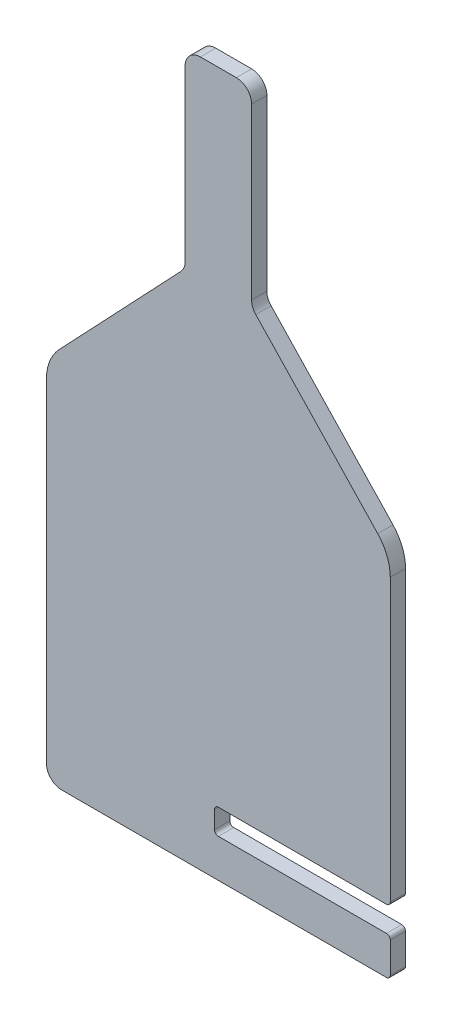
ISO-10303-21;
HEADER;
FILE_DESCRIPTION(('STEP AP214'),'2;1');
FILE_NAME('part.step','',(''),(''),'','','');
FILE_SCHEMA(('AUTOMOTIVE_DESIGN { 1 0 10303 214 1 1 1 1 }'));
ENDSEC;
DATA;
#1=APPLICATION_CONTEXT('core data for automotive mechanical design processes');
#2=APPLICATION_PROTOCOL_DEFINITION('international standard','automotive_design',2000,#1);
#3=PRODUCT_CONTEXT('',#1,'mechanical');
#4=PRODUCT('Part','Part','',(#3));
#5=PRODUCT_RELATED_PRODUCT_CATEGORY('part','',(#4));
#6=PRODUCT_DEFINITION_FORMATION('','',#4);
#7=PRODUCT_DEFINITION_CONTEXT('part definition',#1,'design');
#8=PRODUCT_DEFINITION('design','',#6,#7);
#9=PRODUCT_DEFINITION_SHAPE('','',#8);
#10=(LENGTH_UNIT() NAMED_UNIT(*) SI_UNIT(.MILLI.,.METRE.));
#11=(NAMED_UNIT(*) PLANE_ANGLE_UNIT() SI_UNIT($,.RADIAN.));
#12=(NAMED_UNIT(*) SI_UNIT($,.STERADIAN.) SOLID_ANGLE_UNIT());
#13=UNCERTAINTY_MEASURE_WITH_UNIT(LENGTH_MEASURE(1.E-05),#10,'distance_accuracy_value','');
#14=(GEOMETRIC_REPRESENTATION_CONTEXT(3) GLOBAL_UNCERTAINTY_ASSIGNED_CONTEXT((#13)) GLOBAL_UNIT_ASSIGNED_CONTEXT((#10,
#11,#12)) REPRESENTATION_CONTEXT('',''));
#15=CARTESIAN_POINT('',(0.,0.,0.));
#16=DIRECTION('',(0.,0.,1.));
#17=DIRECTION('',(1.,0.,0.));
#18=AXIS2_PLACEMENT_3D('',#15,#16,#17);
#19=CARTESIAN_POINT('',(22.5,0.828732436273287,2.));
#20=DIRECTION('',(1.,0.,0.));
#21=DIRECTION('',(0.,1.,0.));
#22=AXIS2_PLACEMENT_3D('',#19,#20,#21);
#23=PLANE('',#22);
#24=DIRECTION('',(0.,-1.,0.));
#25=VECTOR('',#24,1.);
#26=CARTESIAN_POINT('',(22.5,0.828732436273287,2.));
#27=LINE('',#26,#25);
#28=CARTESIAN_POINT('',(22.5,-1.56102123255414,2.));
#29=VERTEX_POINT('',#28);
#30=CARTESIAN_POINT('',(22.5,-38.3712675637267,2.));
#31=VERTEX_POINT('',#30);
#32=EDGE_CURVE('E376',#29,#31,#27,.T.);
#33=ORIENTED_EDGE('',*,*,#32,.T.);
#34=DIRECTION('',(0.,0.,1.));
#35=VECTOR('',#34,1.);
#36=CARTESIAN_POINT('',(22.5,-38.3712675637267,0.));
#37=LINE('',#36,#35);
#38=CARTESIAN_POINT('',(22.5,-38.3712675637267,0.));
#39=VERTEX_POINT('',#38);
#40=EDGE_CURVE('E327',#31,#39,#37,.F.);
#41=ORIENTED_EDGE('',*,*,#40,.T.);
#42=DIRECTION('',(0.,-1.,0.));
#43=VECTOR('',#42,1.);
#44=CARTESIAN_POINT('',(22.5,0.828732436273287,0.));
#45=LINE('',#44,#43);
#46=CARTESIAN_POINT('',(22.5,-1.56102123255414,0.));
#47=VERTEX_POINT('',#46);
#48=EDGE_CURVE('E224',#47,#39,#45,.T.);
#49=ORIENTED_EDGE('',*,*,#48,.F.);
#50=DIRECTION('',(0.,0.,-1.));
#51=VECTOR('',#50,1.);
#52=CARTESIAN_POINT('',(22.5,-1.56102123255414,2.));
#53=LINE('',#52,#51);
#54=EDGE_CURVE('E292',#47,#29,#53,.F.);
#55=ORIENTED_EDGE('',*,*,#54,.T.);
#56=EDGE_LOOP('',(#33,#41,#49,#55));
#57=FACE_BOUND('',#56,.T.);
#58=ADVANCED_FACE('F37',(#57),#23,.T.);
#59=CARTESIAN_POINT('',(-4.35,45.,2.));
#60=DIRECTION('',(0.,1.,0.));
#61=DIRECTION('',(0.,0.,1.));
#62=AXIS2_PLACEMENT_3D('',#59,#60,#61);
#63=PLANE('',#62);
#64=DIRECTION('',(1.,0.,0.));
#65=VECTOR('',#64,1.);
#66=CARTESIAN_POINT('',(-4.35,45.,0.));
#67=LINE('',#66,#65);
#68=CARTESIAN_POINT('',(-2.35,45.,0.));
#69=VERTEX_POINT('',#68);
#70=CARTESIAN_POINT('',(2.35,45.,0.));
#71=VERTEX_POINT('',#70);
#72=EDGE_CURVE('E348',#69,#71,#67,.T.);
#73=ORIENTED_EDGE('',*,*,#72,.F.);
#74=DIRECTION('',(0.,0.,-1.));
#75=VECTOR('',#74,1.);
#76=CARTESIAN_POINT('',(-2.35,45.,2.));
#77=LINE('',#76,#75);
#78=CARTESIAN_POINT('',(-2.35,45.,2.));
#79=VERTEX_POINT('',#78);
#80=EDGE_CURVE('E259',#69,#79,#77,.F.);
#81=ORIENTED_EDGE('',*,*,#80,.T.);
#82=DIRECTION('',(1.,0.,0.));
#83=VECTOR('',#82,1.);
#84=CARTESIAN_POINT('',(-4.35,45.,2.));
#85=LINE('',#84,#83);
#86=CARTESIAN_POINT('',(2.35,45.,2.));
#87=VERTEX_POINT('',#86);
#88=EDGE_CURVE('E237',#79,#87,#85,.T.);
#89=ORIENTED_EDGE('',*,*,#88,.T.);
#90=DIRECTION('',(0.,0.,-1.));
#91=VECTOR('',#90,1.);
#92=CARTESIAN_POINT('',(2.35,45.,2.));
#93=LINE('',#92,#91);
#94=EDGE_CURVE('E256',#87,#71,#93,.T.);
#95=ORIENTED_EDGE('',*,*,#94,.T.);
#96=EDGE_LOOP('',(#73,#81,#89,#95));
#97=FACE_BOUND('',#96,.T.);
#98=ADVANCED_FACE('F432',(#97),#63,.T.);
#99=CARTESIAN_POINT('',(-4.35,45.,2.));
#100=DIRECTION('',(1.,0.,0.));
#101=DIRECTION('',(0.,1.,0.));
#102=AXIS2_PLACEMENT_3D('',#99,#100,#101);
#103=PLANE('',#102);
#104=DIRECTION('',(0.,-1.,0.));
#105=VECTOR('',#104,1.);
#106=CARTESIAN_POINT('',(-4.35,45.,0.));
#107=LINE('',#106,#105);
#108=CARTESIAN_POINT('',(-4.35,43.,0.));
#109=VERTEX_POINT('',#108);
#110=CARTESIAN_POINT('',(-4.34999999999999,20.7965545384323,0.));
#111=VERTEX_POINT('',#110);
#112=EDGE_CURVE('E235',#109,#111,#107,.T.);
#113=ORIENTED_EDGE('',*,*,#112,.T.);
#114=DIRECTION('',(0.,0.,-1.));
#115=VECTOR('',#114,1.);
#116=CARTESIAN_POINT('',(-4.34999999999999,20.7965545384323,2.));
#117=LINE('',#116,#115);
#118=CARTESIAN_POINT('',(-4.34999999999999,20.7965545384323,2.));
#119=VERTEX_POINT('',#118);
#120=EDGE_CURVE('E254',#111,#119,#117,.F.);
#121=ORIENTED_EDGE('',*,*,#120,.T.);
#122=DIRECTION('',(0.,-1.,0.));
#123=VECTOR('',#122,1.);
#124=CARTESIAN_POINT('',(-4.35,45.,2.));
#125=LINE('',#124,#123);
#126=CARTESIAN_POINT('',(-4.35,43.,2.));
#127=VERTEX_POINT('',#126);
#128=EDGE_CURVE('E218',#127,#119,#125,.T.);
#129=ORIENTED_EDGE('',*,*,#128,.F.);
#130=DIRECTION('',(0.,0.,-1.));
#131=VECTOR('',#130,1.);
#132=CARTESIAN_POINT('',(-4.35,43.,0.));
#133=LINE('',#132,#131);
#134=EDGE_CURVE('E251',#127,#109,#133,.T.);
#135=ORIENTED_EDGE('',*,*,#134,.T.);
#136=EDGE_LOOP('',(#113,#121,#129,#135));
#137=FACE_BOUND('',#136,.T.);
#138=ADVANCED_FACE('F438',(#137),#103,.F.);
#139=CARTESIAN_POINT('',(-4.34999999999999,20.,2.));
#140=DIRECTION('',(0.72618437741389,-0.687500000000001,0.));
#141=DIRECTION('',(0.687500000000001,0.72618437741389,0.));
#142=AXIS2_PLACEMENT_3D('',#139,#140,#141);
#143=PLANE('',#142);
#144=DIRECTION('',(-0.6875,-0.72618437741389,0.));
#145=VECTOR('',#144,1.);
#146=CARTESIAN_POINT('',(-4.34999999999999,20.,0.));
#147=LINE('',#146,#145);
#148=CARTESIAN_POINT('',(-4.89763124517221,19.4215545384323,0.));
#149=VERTEX_POINT('',#148);
#150=CARTESIAN_POINT('',(-20.8571062644833,2.56406882097633,0.));
#151=VERTEX_POINT('',#150);
#152=EDGE_CURVE('E226',#149,#151,#147,.T.);
#153=ORIENTED_EDGE('',*,*,#152,.T.);
#154=DIRECTION('',(0.,0.,-1.));
#155=VECTOR('',#154,1.);
#156=CARTESIAN_POINT('',(-20.8571062644833,2.56406882097634,2.));
#157=LINE('',#156,#155);
#158=CARTESIAN_POINT('',(-20.8571062644833,2.56406882097633,2.));
#159=VERTEX_POINT('',#158);
#160=EDGE_CURVE('E283',#151,#159,#157,.F.);
#161=ORIENTED_EDGE('',*,*,#160,.T.);
#162=DIRECTION('',(-0.6875,-0.72618437741389,0.));
#163=VECTOR('',#162,1.);
#164=CARTESIAN_POINT('',(-4.34999999999999,20.,2.));
#165=LINE('',#164,#163);
#166=CARTESIAN_POINT('',(-4.89763124517221,19.4215545384323,2.));
#167=VERTEX_POINT('',#166);
#168=EDGE_CURVE('E381',#167,#159,#165,.T.);
#169=ORIENTED_EDGE('',*,*,#168,.F.);
#170=DIRECTION('',(0.,0.,-1.));
#171=VECTOR('',#170,1.);
#172=CARTESIAN_POINT('',(-4.89763124517221,19.4215545384323,0.));
#173=LINE('',#172,#171);
#174=EDGE_CURVE('E248',#167,#149,#173,.T.);
#175=ORIENTED_EDGE('',*,*,#174,.T.);
#176=EDGE_LOOP('',(#153,#161,#169,#175));
#177=FACE_BOUND('',#176,.T.);
#178=ADVANCED_FACE('F414',(#177),#143,.F.);
#179=CARTESIAN_POINT('',(-22.5,0.828732436273288,2.));
#180=DIRECTION('',(1.,0.,0.));
#181=DIRECTION('',(0.,1.,0.));
#182=AXIS2_PLACEMENT_3D('',#179,#180,#181);
#183=PLANE('',#182);
#184=DIRECTION('',(0.,-1.,0.));
#185=VECTOR('',#184,1.);
#186=CARTESIAN_POINT('',(-22.5,0.828732436273288,2.));
#187=LINE('',#186,#185);
#188=CARTESIAN_POINT('',(-22.5,-1.56093117902367,2.));
#189=VERTEX_POINT('',#188);
#190=CARTESIAN_POINT('',(-22.5,-45.1712675637267,2.));
#191=VERTEX_POINT('',#190);
#192=EDGE_CURVE('E379',#189,#191,#187,.T.);
#193=ORIENTED_EDGE('',*,*,#192,.F.);
#194=DIRECTION('',(0.,0.,-1.));
#195=VECTOR('',#194,1.);
#196=CARTESIAN_POINT('',(-22.5,-1.56093117902367,2.));
#197=LINE('',#196,#195);
#198=CARTESIAN_POINT('',(-22.5,-1.56093117902367,0.));
#199=VERTEX_POINT('',#198);
#200=EDGE_CURVE('E276',#189,#199,#197,.T.);
#201=ORIENTED_EDGE('',*,*,#200,.T.);
#202=DIRECTION('',(0.,-1.,0.));
#203=VECTOR('',#202,1.);
#204=CARTESIAN_POINT('',(-22.5,0.828732436273288,0.));
#205=LINE('',#204,#203);
#206=CARTESIAN_POINT('',(-22.5,-45.1712675637267,0.));
#207=VERTEX_POINT('',#206);
#208=EDGE_CURVE('E223',#199,#207,#205,.T.);
#209=ORIENTED_EDGE('',*,*,#208,.T.);
#210=DIRECTION('',(0.,0.,-1.));
#211=VECTOR('',#210,1.);
#212=CARTESIAN_POINT('',(-22.5,-45.1712675637267,2.));
#213=LINE('',#212,#211);
#214=EDGE_CURVE('E203',#207,#191,#213,.F.);
#215=ORIENTED_EDGE('',*,*,#214,.T.);
#216=EDGE_LOOP('',(#193,#201,#209,#215));
#217=FACE_BOUND('',#216,.T.);
#218=ADVANCED_FACE('F409',(#217),#183,.F.);
#219=CARTESIAN_POINT('',(-22.5,-47.1712675637267,2.));
#220=DIRECTION('',(0.,1.,0.));
#221=DIRECTION('',(0.,0.,1.));
#222=AXIS2_PLACEMENT_3D('',#219,#220,#221);
#223=PLANE('',#222);
#224=DIRECTION('',(1.,0.,0.));
#225=VECTOR('',#224,1.);
#226=CARTESIAN_POINT('',(-22.5,-47.1712675637267,0.));
#227=LINE('',#226,#225);
#228=CARTESIAN_POINT('',(-20.5,-47.1712675637267,0.));
#229=VERTEX_POINT('',#228);
#230=CARTESIAN_POINT('',(22.,-47.1712675637267,0.));
#231=VERTEX_POINT('',#230);
#232=EDGE_CURVE('E213',#229,#231,#227,.T.);
#233=ORIENTED_EDGE('',*,*,#232,.T.);
#234=DIRECTION('',(0.,0.,-1.));
#235=VECTOR('',#234,1.);
#236=CARTESIAN_POINT('',(22.,-47.1712675637267,2.));
#237=LINE('',#236,#235);
#238=CARTESIAN_POINT('',(22.,-47.1712675637267,2.));
#239=VERTEX_POINT('',#238);
#240=EDGE_CURVE('E305',#231,#239,#237,.F.);
#241=ORIENTED_EDGE('',*,*,#240,.T.);
#242=DIRECTION('',(1.,0.,0.));
#243=VECTOR('',#242,1.);
#244=CARTESIAN_POINT('',(-22.5,-47.1712675637267,2.));
#245=LINE('',#244,#243);
#246=CARTESIAN_POINT('',(-20.5,-47.1712675637267,2.));
#247=VERTEX_POINT('',#246);
#248=EDGE_CURVE('E216',#247,#239,#245,.T.);
#249=ORIENTED_EDGE('',*,*,#248,.F.);
#250=DIRECTION('',(0.,0.,-1.));
#251=VECTOR('',#250,1.);
#252=CARTESIAN_POINT('',(-20.5,-47.1712675637267,2.));
#253=LINE('',#252,#251);
#254=EDGE_CURVE('E201',#247,#229,#253,.T.);
#255=ORIENTED_EDGE('',*,*,#254,.T.);
#256=EDGE_LOOP('',(#233,#241,#249,#255));
#257=FACE_BOUND('',#256,.T.);
#258=ADVANCED_FACE('F212',(#257),#223,.F.);
#259=CARTESIAN_POINT('',(22.5,-42.6712675637267,2.));
#260=VERTEX_POINT('',#259);
#261=CARTESIAN_POINT('',(22.5,-46.6712675637267,2.));
#262=VERTEX_POINT('',#261);
#263=EDGE_CURVE('E375',#260,#262,#27,.T.);
#264=ORIENTED_EDGE('',*,*,#263,.T.);
#265=DIRECTION('',(0.,0.,-1.));
#266=VECTOR('',#265,1.);
#267=CARTESIAN_POINT('',(22.5,-46.6712675637267,0.));
#268=LINE('',#267,#266);
#269=CARTESIAN_POINT('',(22.5,-46.6712675637267,0.));
#270=VERTEX_POINT('',#269);
#271=EDGE_CURVE('E297',#262,#270,#268,.T.);
#272=ORIENTED_EDGE('',*,*,#271,.T.);
#273=CARTESIAN_POINT('',(22.5,-42.6712675637267,0.));
#274=VERTEX_POINT('',#273);
#275=EDGE_CURVE('E229',#274,#270,#45,.T.);
#276=ORIENTED_EDGE('',*,*,#275,.F.);
#277=DIRECTION('',(0.,0.,1.));
#278=VECTOR('',#277,1.);
#279=CARTESIAN_POINT('',(22.5,-42.6712675637267,2.));
#280=LINE('',#279,#278);
#281=EDGE_CURVE('E294',#274,#260,#280,.T.);
#282=ORIENTED_EDGE('',*,*,#281,.T.);
#283=EDGE_LOOP('',(#264,#272,#276,#282));
#284=FACE_BOUND('',#283,.T.);
#285=ADVANCED_FACE('F397',(#284),#23,.T.);
#286=CARTESIAN_POINT('',(4.35000000000001,19.9990051587737,2.));
#287=DIRECTION('',(0.726166565397782,0.687518813777767,0.));
#288=DIRECTION('',(-0.687518813777767,0.726166565397782,0.));
#289=AXIS2_PLACEMENT_3D('',#286,#287,#288);
#290=PLANE('',#289);
#291=DIRECTION('',(0.687518813777767,-0.726166565397782,0.));
#292=VECTOR('',#291,1.);
#293=CARTESIAN_POINT('',(4.35000000000001,19.9990051587737,2.));
#294=LINE('',#293,#292);
#295=CARTESIAN_POINT('',(4.89766686920444,19.4205520874939,2.));
#296=VERTEX_POINT('',#295);
#297=CARTESIAN_POINT('',(20.8569993923867,2.56409165011246,2.));
#298=VERTEX_POINT('',#297);
#299=EDGE_CURVE('E372',#296,#298,#294,.T.);
#300=ORIENTED_EDGE('',*,*,#299,.T.);
#301=DIRECTION('',(0.,0.,-1.));
#302=VECTOR('',#301,1.);
#303=CARTESIAN_POINT('',(20.8569993923867,2.56409165011245,2.));
#304=LINE('',#303,#302);
#305=CARTESIAN_POINT('',(20.8569993923867,2.56409165011246,0.));
#306=VERTEX_POINT('',#305);
#307=EDGE_CURVE('E289',#298,#306,#304,.T.);
#308=ORIENTED_EDGE('',*,*,#307,.T.);
#309=DIRECTION('',(0.687518813777767,-0.726166565397782,0.));
#310=VECTOR('',#309,1.);
#311=CARTESIAN_POINT('',(4.35000000000001,19.9990051587737,0.));
#312=LINE('',#311,#310);
#313=CARTESIAN_POINT('',(4.89766686920444,19.4205520874939,0.));
#314=VERTEX_POINT('',#313);
#315=EDGE_CURVE('E390',#314,#306,#312,.T.);
#316=ORIENTED_EDGE('',*,*,#315,.F.);
#317=DIRECTION('',(0.,0.,-1.));
#318=VECTOR('',#317,1.);
#319=CARTESIAN_POINT('',(4.89766686920444,19.4205520874939,2.));
#320=LINE('',#319,#318);
#321=EDGE_CURVE('E266',#314,#296,#320,.F.);
#322=ORIENTED_EDGE('',*,*,#321,.T.);
#323=EDGE_LOOP('',(#300,#308,#316,#322));
#324=FACE_BOUND('',#323,.T.);
#325=ADVANCED_FACE('F444',(#324),#290,.T.);
#326=CARTESIAN_POINT('',(4.35,45.,2.));
#327=DIRECTION('',(1.,0.,0.));
#328=DIRECTION('',(0.,1.,0.));
#329=AXIS2_PLACEMENT_3D('',#326,#327,#328);
#330=PLANE('',#329);
#331=DIRECTION('',(0.,-1.,0.));
#332=VECTOR('',#331,1.);
#333=CARTESIAN_POINT('',(4.35,45.,2.));
#334=LINE('',#333,#332);
#335=CARTESIAN_POINT('',(4.35,43.,2.));
#336=VERTEX_POINT('',#335);
#337=CARTESIAN_POINT('',(4.35000000000001,20.7955897150495,2.));
#338=VERTEX_POINT('',#337);
#339=EDGE_CURVE('E369',#336,#338,#334,.T.);
#340=ORIENTED_EDGE('',*,*,#339,.T.);
#341=DIRECTION('',(0.,0.,-1.));
#342=VECTOR('',#341,1.);
#343=CARTESIAN_POINT('',(4.35000000000001,20.7955897150495,0.));
#344=LINE('',#343,#342);
#345=CARTESIAN_POINT('',(4.35000000000001,20.7955897150495,0.));
#346=VERTEX_POINT('',#345);
#347=EDGE_CURVE('E263',#338,#346,#344,.T.);
#348=ORIENTED_EDGE('',*,*,#347,.T.);
#349=DIRECTION('',(0.,-1.,0.));
#350=VECTOR('',#349,1.);
#351=CARTESIAN_POINT('',(4.35,45.,0.));
#352=LINE('',#351,#350);
#353=CARTESIAN_POINT('',(4.35,43.,0.));
#354=VERTEX_POINT('',#353);
#355=EDGE_CURVE('E388',#354,#346,#352,.T.);
#356=ORIENTED_EDGE('',*,*,#355,.F.);
#357=DIRECTION('',(0.,0.,-1.));
#358=VECTOR('',#357,1.);
#359=CARTESIAN_POINT('',(4.35,43.,2.));
#360=LINE('',#359,#358);
#361=EDGE_CURVE('E261',#354,#336,#360,.F.);
#362=ORIENTED_EDGE('',*,*,#361,.T.);
#363=EDGE_LOOP('',(#340,#348,#356,#362));
#364=FACE_BOUND('',#363,.T.);
#365=ADVANCED_FACE('F449',(#364),#330,.T.);
#366=CARTESIAN_POINT('',(0.,0.,2.));
#367=DIRECTION('',(0.,0.,-1.));
#368=DIRECTION('',(-1.,0.,0.));
#369=AXIS2_PLACEMENT_3D('',#366,#367,#368);
#370=PLANE('',#369);
#371=ORIENTED_EDGE('',*,*,#248,.T.);
#372=CARTESIAN_POINT('',(22.,-46.6712675637267,2.));
#373=DIRECTION('',(0.,0.,-1.));
#374=DIRECTION('',(-1.,0.,0.));
#375=AXIS2_PLACEMENT_3D('',#372,#373,#374);
#376=CIRCLE('',#375,0.5);
#377=EDGE_CURVE('E310',#239,#262,#376,.F.);
#378=ORIENTED_EDGE('',*,*,#377,.T.);
#379=ORIENTED_EDGE('',*,*,#263,.F.);
#380=CARTESIAN_POINT('',(22.,-42.6712675637267,2.));
#381=DIRECTION('',(0.,0.,-1.));
#382=DIRECTION('',(-1.,0.,0.));
#383=AXIS2_PLACEMENT_3D('',#380,#381,#382);
#384=CIRCLE('',#383,0.5);
#385=CARTESIAN_POINT('',(22.,-42.1712675637267,2.));
#386=VERTEX_POINT('',#385);
#387=EDGE_CURVE('E308',#260,#386,#384,.F.);
#388=ORIENTED_EDGE('',*,*,#387,.T.);
#389=DIRECTION('',(1.,0.,0.));
#390=VECTOR('',#389,1.);
#391=CARTESIAN_POINT('',(22.5,-42.1712675637267,2.));
#392=LINE('',#391,#390);
#393=CARTESIAN_POINT('',(0.,-42.1712675637267,2.));
#394=VERTEX_POINT('',#393);
#395=EDGE_CURVE('E354',#394,#386,#392,.T.);
#396=ORIENTED_EDGE('',*,*,#395,.F.);
#397=CARTESIAN_POINT('',(0.,-41.6712675637267,2.));
#398=DIRECTION('',(0.,0.,-1.));
#399=DIRECTION('',(-1.,0.,0.));
#400=AXIS2_PLACEMENT_3D('',#397,#398,#399);
#401=CIRCLE('',#400,0.5);
#402=CARTESIAN_POINT('',(-0.500000000000001,-41.6712675637267,2.));
#403=VERTEX_POINT('',#402);
#404=EDGE_CURVE('E329',#394,#403,#401,.T.);
#405=ORIENTED_EDGE('',*,*,#404,.T.);
#406=DIRECTION('',(0.,-1.,0.));
#407=VECTOR('',#406,1.);
#408=CARTESIAN_POINT('',(-0.500000000000001,-38.8712675637267,2.));
#409=LINE('',#408,#407);
#410=CARTESIAN_POINT('',(-0.500000000000001,-39.3712675637267,2.));
#411=VERTEX_POINT('',#410);
#412=EDGE_CURVE('E353',#411,#403,#409,.T.);
#413=ORIENTED_EDGE('',*,*,#412,.F.);
#414=CARTESIAN_POINT('',(0.,-39.3712675637267,2.));
#415=DIRECTION('',(0.,0.,-1.));
#416=DIRECTION('',(-1.,0.,0.));
#417=AXIS2_PLACEMENT_3D('',#414,#415,#416);
#418=CIRCLE('',#417,0.5);
#419=CARTESIAN_POINT('',(0.,-38.8712675637267,2.));
#420=VERTEX_POINT('',#419);
#421=EDGE_CURVE('E45',#411,#420,#418,.T.);
#422=ORIENTED_EDGE('',*,*,#421,.T.);
#423=DIRECTION('',(-1.,0.,0.));
#424=VECTOR('',#423,1.);
#425=CARTESIAN_POINT('',(22.5,-38.8712675637267,2.));
#426=LINE('',#425,#424);
#427=CARTESIAN_POINT('',(22.,-38.8712675637267,2.));
#428=VERTEX_POINT('',#427);
#429=EDGE_CURVE('E358',#428,#420,#426,.T.);
#430=ORIENTED_EDGE('',*,*,#429,.F.);
#431=CARTESIAN_POINT('',(22.,-38.3712675637267,2.));
#432=DIRECTION('',(0.,0.,-1.));
#433=DIRECTION('',(-1.,0.,0.));
#434=AXIS2_PLACEMENT_3D('',#431,#432,#433);
#435=CIRCLE('',#434,0.5);
#436=EDGE_CURVE('E52',#428,#31,#435,.F.);
#437=ORIENTED_EDGE('',*,*,#436,.T.);
#438=ORIENTED_EDGE('',*,*,#32,.F.);
#439=CARTESIAN_POINT('',(16.5,-1.56102123255415,2.));
#440=DIRECTION('',(0.,0.,-1.));
#441=DIRECTION('',(-1.,0.,0.));
#442=AXIS2_PLACEMENT_3D('',#439,#440,#441);
#443=CIRCLE('',#442,6.);
#444=EDGE_CURVE('E285',#29,#298,#443,.F.);
#445=ORIENTED_EDGE('',*,*,#444,.T.);
#446=ORIENTED_EDGE('',*,*,#299,.F.);
#447=CARTESIAN_POINT('',(6.35000000000001,20.7955897150495,2.));
#448=DIRECTION('',(0.,0.,-1.));
#449=DIRECTION('',(-1.,0.,0.));
#450=AXIS2_PLACEMENT_3D('',#447,#448,#449);
#451=CIRCLE('',#450,2.);
#452=EDGE_CURVE('E274',#296,#338,#451,.T.);
#453=ORIENTED_EDGE('',*,*,#452,.T.);
#454=ORIENTED_EDGE('',*,*,#339,.F.);
#455=CARTESIAN_POINT('',(2.35,43.,2.));
#456=DIRECTION('',(0.,0.,-1.));
#457=DIRECTION('',(-1.,0.,0.));
#458=AXIS2_PLACEMENT_3D('',#455,#456,#457);
#459=CIRCLE('',#458,2.);
#460=EDGE_CURVE('E242',#336,#87,#459,.F.);
#461=ORIENTED_EDGE('',*,*,#460,.T.);
#462=ORIENTED_EDGE('',*,*,#88,.F.);
#463=CARTESIAN_POINT('',(-2.35,43.,2.));
#464=DIRECTION('',(0.,0.,-1.));
#465=DIRECTION('',(-1.,0.,0.));
#466=AXIS2_PLACEMENT_3D('',#463,#464,#465);
#467=CIRCLE('',#466,2.);
#468=EDGE_CURVE('E244',#79,#127,#467,.F.);
#469=ORIENTED_EDGE('',*,*,#468,.T.);
#470=ORIENTED_EDGE('',*,*,#128,.T.);
#471=CARTESIAN_POINT('',(-6.34999999999999,20.7965545384323,2.));
#472=DIRECTION('',(0.,0.,-1.));
#473=DIRECTION('',(-1.,0.,0.));
#474=AXIS2_PLACEMENT_3D('',#471,#472,#473);
#475=CIRCLE('',#474,2.);
#476=EDGE_CURVE('E270',#119,#167,#475,.T.);
#477=ORIENTED_EDGE('',*,*,#476,.T.);
#478=ORIENTED_EDGE('',*,*,#168,.T.);
#479=CARTESIAN_POINT('',(-16.5,-1.56093117902366,2.));
#480=DIRECTION('',(0.,0.,-1.));
#481=DIRECTION('',(-1.,0.,0.));
#482=AXIS2_PLACEMENT_3D('',#479,#480,#481);
#483=CIRCLE('',#482,6.);
#484=EDGE_CURVE('E287',#159,#189,#483,.F.);
#485=ORIENTED_EDGE('',*,*,#484,.T.);
#486=ORIENTED_EDGE('',*,*,#192,.T.);
#487=CARTESIAN_POINT('',(-20.5,-45.1712675637267,2.));
#488=DIRECTION('',(0.,0.,-1.));
#489=DIRECTION('',(-1.,0.,0.));
#490=AXIS2_PLACEMENT_3D('',#487,#488,#489);
#491=CIRCLE('',#490,2.);
#492=EDGE_CURVE('E246',#191,#247,#491,.F.);
#493=ORIENTED_EDGE('',*,*,#492,.T.);
#494=EDGE_LOOP('',(#371,#378,#379,#388,#396,#405,#413,#422,#430,#437,#438,#445,#446,#453,#454,
#461,#462,#469,#470,#477,#478,#485,#486,#493));
#495=FACE_BOUND('',#494,.T.);
#496=ADVANCED_FACE('F352',(#495),#370,.F.);
#497=CARTESIAN_POINT('',(0.,0.,0.));
#498=DIRECTION('',(0.,0.,-1.));
#499=DIRECTION('',(-1.,0.,0.));
#500=AXIS2_PLACEMENT_3D('',#497,#498,#499);
#501=PLANE('',#500);
#502=ORIENTED_EDGE('',*,*,#275,.T.);
#503=CARTESIAN_POINT('',(22.,-46.6712675637267,0.));
#504=DIRECTION('',(0.,0.,-1.));
#505=DIRECTION('',(-1.,0.,0.));
#506=AXIS2_PLACEMENT_3D('',#503,#504,#505);
#507=CIRCLE('',#506,0.5);
#508=EDGE_CURVE('E222',#270,#231,#507,.T.);
#509=ORIENTED_EDGE('',*,*,#508,.T.);
#510=ORIENTED_EDGE('',*,*,#232,.F.);
#511=CARTESIAN_POINT('',(-20.5,-45.1712675637267,0.));
#512=DIRECTION('',(0.,0.,-1.));
#513=DIRECTION('',(-1.,0.,0.));
#514=AXIS2_PLACEMENT_3D('',#511,#512,#513);
#515=CIRCLE('',#514,2.);
#516=EDGE_CURVE('E197',#229,#207,#515,.T.);
#517=ORIENTED_EDGE('',*,*,#516,.T.);
#518=ORIENTED_EDGE('',*,*,#208,.F.);
#519=CARTESIAN_POINT('',(-16.5,-1.56093117902366,0.));
#520=DIRECTION('',(0.,0.,-1.));
#521=DIRECTION('',(-1.,0.,0.));
#522=AXIS2_PLACEMENT_3D('',#519,#520,#521);
#523=CIRCLE('',#522,6.);
#524=EDGE_CURVE('E281',#199,#151,#523,.T.);
#525=ORIENTED_EDGE('',*,*,#524,.T.);
#526=ORIENTED_EDGE('',*,*,#152,.F.);
#527=CARTESIAN_POINT('',(-6.34999999999999,20.7965545384323,0.));
#528=DIRECTION('',(0.,0.,-1.));
#529=DIRECTION('',(-1.,0.,0.));
#530=AXIS2_PLACEMENT_3D('',#527,#528,#529);
#531=CIRCLE('',#530,2.);
#532=EDGE_CURVE('E268',#149,#111,#531,.F.);
#533=ORIENTED_EDGE('',*,*,#532,.T.);
#534=ORIENTED_EDGE('',*,*,#112,.F.);
#535=CARTESIAN_POINT('',(-2.35,43.,0.));
#536=DIRECTION('',(0.,0.,-1.));
#537=DIRECTION('',(-1.,0.,0.));
#538=AXIS2_PLACEMENT_3D('',#535,#536,#537);
#539=CIRCLE('',#538,2.);
#540=EDGE_CURVE('E207',#109,#69,#539,.T.);
#541=ORIENTED_EDGE('',*,*,#540,.T.);
#542=ORIENTED_EDGE('',*,*,#72,.T.);
#543=CARTESIAN_POINT('',(2.35,43.,0.));
#544=DIRECTION('',(0.,0.,-1.));
#545=DIRECTION('',(-1.,0.,0.));
#546=AXIS2_PLACEMENT_3D('',#543,#544,#545);
#547=CIRCLE('',#546,2.);
#548=EDGE_CURVE('E217',#71,#354,#547,.T.);
#549=ORIENTED_EDGE('',*,*,#548,.T.);
#550=ORIENTED_EDGE('',*,*,#355,.T.);
#551=CARTESIAN_POINT('',(6.35000000000001,20.7955897150495,0.));
#552=DIRECTION('',(0.,0.,-1.));
#553=DIRECTION('',(-1.,0.,0.));
#554=AXIS2_PLACEMENT_3D('',#551,#552,#553);
#555=CIRCLE('',#554,2.);
#556=EDGE_CURVE('E272',#346,#314,#555,.F.);
#557=ORIENTED_EDGE('',*,*,#556,.T.);
#558=ORIENTED_EDGE('',*,*,#315,.T.);
#559=CARTESIAN_POINT('',(16.5,-1.56102123255415,0.));
#560=DIRECTION('',(0.,0.,-1.));
#561=DIRECTION('',(-1.,0.,0.));
#562=AXIS2_PLACEMENT_3D('',#559,#560,#561);
#563=CIRCLE('',#562,6.);
#564=EDGE_CURVE('E279',#306,#47,#563,.T.);
#565=ORIENTED_EDGE('',*,*,#564,.T.);
#566=ORIENTED_EDGE('',*,*,#48,.T.);
#567=CARTESIAN_POINT('',(22.,-38.3712675637267,0.));
#568=DIRECTION('',(0.,0.,-1.));
#569=DIRECTION('',(-1.,0.,0.));
#570=AXIS2_PLACEMENT_3D('',#567,#568,#569);
#571=CIRCLE('',#570,0.5);
#572=CARTESIAN_POINT('',(22.,-38.8712675637267,0.));
#573=VERTEX_POINT('',#572);
#574=EDGE_CURVE('E300',#39,#573,#571,.T.);
#575=ORIENTED_EDGE('',*,*,#574,.T.);
#576=DIRECTION('',(-1.,0.,0.));
#577=VECTOR('',#576,1.);
#578=CARTESIAN_POINT('',(22.5,-38.8712675637267,0.));
#579=LINE('',#578,#577);
#580=CARTESIAN_POINT('',(0.,-38.8712675637267,0.));
#581=VERTEX_POINT('',#580);
#582=EDGE_CURVE('E360',#573,#581,#579,.T.);
#583=ORIENTED_EDGE('',*,*,#582,.T.);
#584=CARTESIAN_POINT('',(0.,-39.3712675637267,0.));
#585=DIRECTION('',(0.,0.,-1.));
#586=DIRECTION('',(-1.,0.,0.));
#587=AXIS2_PLACEMENT_3D('',#584,#585,#586);
#588=CIRCLE('',#587,0.5);
#589=CARTESIAN_POINT('',(-0.500000000000001,-39.3712675637267,0.));
#590=VERTEX_POINT('',#589);
#591=EDGE_CURVE('E11',#581,#590,#588,.F.);
#592=ORIENTED_EDGE('',*,*,#591,.T.);
#593=DIRECTION('',(0.,-1.,0.));
#594=VECTOR('',#593,1.);
#595=CARTESIAN_POINT('',(-0.500000000000001,-38.8712675637267,0.));
#596=LINE('',#595,#594);
#597=CARTESIAN_POINT('',(-0.500000000000001,-41.6712675637267,0.));
#598=VERTEX_POINT('',#597);
#599=EDGE_CURVE('E339',#590,#598,#596,.T.);
#600=ORIENTED_EDGE('',*,*,#599,.T.);
#601=CARTESIAN_POINT('',(0.,-41.6712675637267,0.));
#602=DIRECTION('',(0.,0.,-1.));
#603=DIRECTION('',(-1.,0.,0.));
#604=AXIS2_PLACEMENT_3D('',#601,#602,#603);
#605=CIRCLE('',#604,0.5);
#606=CARTESIAN_POINT('',(0.,-42.1712675637267,0.));
#607=VERTEX_POINT('',#606);
#608=EDGE_CURVE('E331',#598,#607,#605,.F.);
#609=ORIENTED_EDGE('',*,*,#608,.T.);
#610=DIRECTION('',(1.,0.,0.));
#611=VECTOR('',#610,1.);
#612=CARTESIAN_POINT('',(22.5,-42.1712675637267,0.));
#613=LINE('',#612,#611);
#614=CARTESIAN_POINT('',(22.,-42.1712675637267,0.));
#615=VERTEX_POINT('',#614);
#616=EDGE_CURVE('E336',#607,#615,#613,.T.);
#617=ORIENTED_EDGE('',*,*,#616,.T.);
#618=CARTESIAN_POINT('',(22.,-42.6712675637267,0.));
#619=DIRECTION('',(0.,0.,-1.));
#620=DIRECTION('',(-1.,0.,0.));
#621=AXIS2_PLACEMENT_3D('',#618,#619,#620);
#622=CIRCLE('',#621,0.5);
#623=EDGE_CURVE('E302',#615,#274,#622,.T.);
#624=ORIENTED_EDGE('',*,*,#623,.T.);
#625=EDGE_LOOP('',(#502,#509,#510,#517,#518,#525,#526,#533,#534,#541,#542,#549,#550,#557,#558,
#565,#566,#575,#583,#592,#600,#609,#617,#624));
#626=FACE_BOUND('',#625,.T.);
#627=ADVANCED_FACE('F221',(#626),#501,.T.);
#628=CARTESIAN_POINT('',(22.5,-38.8712675637267,-23.2355331335435));
#629=DIRECTION('',(0.,1.,0.));
#630=DIRECTION('',(0.,0.,1.));
#631=AXIS2_PLACEMENT_3D('',#628,#629,#630);
#632=PLANE('',#631);
#633=ORIENTED_EDGE('',*,*,#429,.T.);
#634=DIRECTION('',(0.,0.,1.));
#635=VECTOR('',#634,1.);
#636=CARTESIAN_POINT('',(0.,-38.8712675637267,0.));
#637=LINE('',#636,#635);
#638=EDGE_CURVE('E325',#420,#581,#637,.F.);
#639=ORIENTED_EDGE('',*,*,#638,.T.);
#640=ORIENTED_EDGE('',*,*,#582,.F.);
#641=DIRECTION('',(0.,0.,1.));
#642=VECTOR('',#641,1.);
#643=CARTESIAN_POINT('',(22.,-38.8712675637267,2.));
#644=LINE('',#643,#642);
#645=EDGE_CURVE('E322',#573,#428,#644,.T.);
#646=ORIENTED_EDGE('',*,*,#645,.T.);
#647=EDGE_LOOP('',(#633,#639,#640,#646));
#648=FACE_BOUND('',#647,.T.);
#649=ADVANCED_FACE('F463',(#648),#632,.F.);
#650=CARTESIAN_POINT('',(-0.500000000000001,-38.8712675637267,-23.2355331335435));
#651=DIRECTION('',(-1.,0.,0.));
#652=DIRECTION('',(0.,-1.,0.));
#653=AXIS2_PLACEMENT_3D('',#650,#651,#652);
#654=PLANE('',#653);
#655=ORIENTED_EDGE('',*,*,#412,.T.);
#656=DIRECTION('',(0.,0.,1.));
#657=VECTOR('',#656,1.);
#658=CARTESIAN_POINT('',(-0.500000000000001,-41.6712675637267,0.));
#659=LINE('',#658,#657);
#660=EDGE_CURVE('E320',#403,#598,#659,.F.);
#661=ORIENTED_EDGE('',*,*,#660,.T.);
#662=ORIENTED_EDGE('',*,*,#599,.F.);
#663=DIRECTION('',(0.,0.,1.));
#664=VECTOR('',#663,1.);
#665=CARTESIAN_POINT('',(-0.500000000000001,-39.3712675637267,2.));
#666=LINE('',#665,#664);
#667=EDGE_CURVE('E317',#590,#411,#666,.T.);
#668=ORIENTED_EDGE('',*,*,#667,.T.);
#669=EDGE_LOOP('',(#655,#661,#662,#668));
#670=FACE_BOUND('',#669,.T.);
#671=ADVANCED_FACE('F356',(#670),#654,.F.);
#672=CARTESIAN_POINT('',(22.5,-42.1712675637267,-23.2355331335435));
#673=DIRECTION('',(0.,-1.,0.));
#674=DIRECTION('',(0.,0.,-1.));
#675=AXIS2_PLACEMENT_3D('',#672,#673,#674);
#676=PLANE('',#675);
#677=ORIENTED_EDGE('',*,*,#616,.F.);
#678=DIRECTION('',(0.,0.,1.));
#679=VECTOR('',#678,1.);
#680=CARTESIAN_POINT('',(0.,-42.1712675637267,2.));
#681=LINE('',#680,#679);
#682=EDGE_CURVE('E314',#607,#394,#681,.T.);
#683=ORIENTED_EDGE('',*,*,#682,.T.);
#684=ORIENTED_EDGE('',*,*,#395,.T.);
#685=DIRECTION('',(0.,0.,1.));
#686=VECTOR('',#685,1.);
#687=CARTESIAN_POINT('',(22.,-42.1712675637267,0.));
#688=LINE('',#687,#686);
#689=EDGE_CURVE('E312',#386,#615,#688,.F.);
#690=ORIENTED_EDGE('',*,*,#689,.T.);
#691=EDGE_LOOP('',(#677,#683,#684,#690));
#692=FACE_BOUND('',#691,.T.);
#693=ADVANCED_FACE('F344',(#692),#676,.F.);
#694=CARTESIAN_POINT('',(-20.5,-45.1712675637267,2.));
#695=DIRECTION('',(0.,0.,-1.));
#696=DIRECTION('',(-1.,0.,0.));
#697=AXIS2_PLACEMENT_3D('',#694,#695,#696);
#698=CYLINDRICAL_SURFACE('',#697,2.);
#699=ORIENTED_EDGE('',*,*,#492,.F.);
#700=ORIENTED_EDGE('',*,*,#214,.F.);
#701=ORIENTED_EDGE('',*,*,#516,.F.);
#702=ORIENTED_EDGE('',*,*,#254,.F.);
#703=EDGE_LOOP('',(#699,#700,#701,#702));
#704=FACE_BOUND('',#703,.T.);
#705=ADVANCED_FACE('F200',(#704),#698,.T.);
#706=CARTESIAN_POINT('',(-6.34999999999999,20.7965545384323,2.));
#707=DIRECTION('',(0.,0.,1.));
#708=DIRECTION('',(1.,0.,0.));
#709=AXIS2_PLACEMENT_3D('',#706,#707,#708);
#710=CYLINDRICAL_SURFACE('',#709,2.);
#711=ORIENTED_EDGE('',*,*,#476,.F.);
#712=ORIENTED_EDGE('',*,*,#120,.F.);
#713=ORIENTED_EDGE('',*,*,#532,.F.);
#714=ORIENTED_EDGE('',*,*,#174,.F.);
#715=EDGE_LOOP('',(#711,#712,#713,#714));
#716=FACE_BOUND('',#715,.T.);
#717=ADVANCED_FACE('F475',(#716),#710,.F.);
#718=CARTESIAN_POINT('',(-2.35,43.,2.));
#719=DIRECTION('',(0.,0.,1.));
#720=DIRECTION('',(1.,0.,0.));
#721=AXIS2_PLACEMENT_3D('',#718,#719,#720);
#722=CYLINDRICAL_SURFACE('',#721,2.);
#723=ORIENTED_EDGE('',*,*,#468,.F.);
#724=ORIENTED_EDGE('',*,*,#80,.F.);
#725=ORIENTED_EDGE('',*,*,#540,.F.);
#726=ORIENTED_EDGE('',*,*,#134,.F.);
#727=EDGE_LOOP('',(#723,#724,#725,#726));
#728=FACE_BOUND('',#727,.T.);
#729=ADVANCED_FACE('F480',(#728),#722,.T.);
#730=CARTESIAN_POINT('',(6.35000000000001,20.7955897150495,2.));
#731=DIRECTION('',(0.,0.,1.));
#732=DIRECTION('',(1.,0.,0.));
#733=AXIS2_PLACEMENT_3D('',#730,#731,#732);
#734=CYLINDRICAL_SURFACE('',#733,2.);
#735=ORIENTED_EDGE('',*,*,#452,.F.);
#736=ORIENTED_EDGE('',*,*,#321,.F.);
#737=ORIENTED_EDGE('',*,*,#556,.F.);
#738=ORIENTED_EDGE('',*,*,#347,.F.);
#739=EDGE_LOOP('',(#735,#736,#737,#738));
#740=FACE_BOUND('',#739,.T.);
#741=ADVANCED_FACE('F428',(#740),#734,.F.);
#742=CARTESIAN_POINT('',(2.35,43.,2.));
#743=DIRECTION('',(0.,0.,-1.));
#744=DIRECTION('',(-1.,0.,0.));
#745=AXIS2_PLACEMENT_3D('',#742,#743,#744);
#746=CYLINDRICAL_SURFACE('',#745,2.);
#747=ORIENTED_EDGE('',*,*,#460,.F.);
#748=ORIENTED_EDGE('',*,*,#361,.F.);
#749=ORIENTED_EDGE('',*,*,#548,.F.);
#750=ORIENTED_EDGE('',*,*,#94,.F.);
#751=EDGE_LOOP('',(#747,#748,#749,#750));
#752=FACE_BOUND('',#751,.T.);
#753=ADVANCED_FACE('F420',(#752),#746,.T.);
#754=CARTESIAN_POINT('',(-16.5,-1.56093117902366,2.));
#755=DIRECTION('',(0.,0.,-1.));
#756=DIRECTION('',(-1.,0.,0.));
#757=AXIS2_PLACEMENT_3D('',#754,#755,#756);
#758=CYLINDRICAL_SURFACE('',#757,6.);
#759=ORIENTED_EDGE('',*,*,#484,.F.);
#760=ORIENTED_EDGE('',*,*,#160,.F.);
#761=ORIENTED_EDGE('',*,*,#524,.F.);
#762=ORIENTED_EDGE('',*,*,#200,.F.);
#763=EDGE_LOOP('',(#759,#760,#761,#762));
#764=FACE_BOUND('',#763,.T.);
#765=ADVANCED_FACE('F417',(#764),#758,.T.);
#766=CARTESIAN_POINT('',(16.5,-1.56102123255415,2.));
#767=DIRECTION('',(0.,0.,-1.));
#768=DIRECTION('',(-1.,0.,0.));
#769=AXIS2_PLACEMENT_3D('',#766,#767,#768);
#770=CYLINDRICAL_SURFACE('',#769,6.);
#771=ORIENTED_EDGE('',*,*,#444,.F.);
#772=ORIENTED_EDGE('',*,*,#54,.F.);
#773=ORIENTED_EDGE('',*,*,#564,.F.);
#774=ORIENTED_EDGE('',*,*,#307,.F.);
#775=EDGE_LOOP('',(#771,#772,#773,#774));
#776=FACE_BOUND('',#775,.T.);
#777=ADVANCED_FACE('F419',(#776),#770,.T.);
#778=CARTESIAN_POINT('',(22.,-46.6712675637267,2.));
#779=DIRECTION('',(0.,0.,1.));
#780=DIRECTION('',(1.,0.,0.));
#781=AXIS2_PLACEMENT_3D('',#778,#779,#780);
#782=CYLINDRICAL_SURFACE('',#781,0.5);
#783=ORIENTED_EDGE('',*,*,#377,.F.);
#784=ORIENTED_EDGE('',*,*,#240,.F.);
#785=ORIENTED_EDGE('',*,*,#508,.F.);
#786=ORIENTED_EDGE('',*,*,#271,.F.);
#787=EDGE_LOOP('',(#783,#784,#785,#786));
#788=FACE_BOUND('',#787,.T.);
#789=ADVANCED_FACE('F404',(#788),#782,.T.);
#790=CARTESIAN_POINT('',(0.,-41.6712675637267,-23.2355331335435));
#791=DIRECTION('',(0.,0.,-1.));
#792=DIRECTION('',(-1.,0.,0.));
#793=AXIS2_PLACEMENT_3D('',#790,#791,#792);
#794=CYLINDRICAL_SURFACE('',#793,0.5);
#795=ORIENTED_EDGE('',*,*,#608,.F.);
#796=ORIENTED_EDGE('',*,*,#660,.F.);
#797=ORIENTED_EDGE('',*,*,#404,.F.);
#798=ORIENTED_EDGE('',*,*,#682,.F.);
#799=EDGE_LOOP('',(#795,#796,#797,#798));
#800=FACE_BOUND('',#799,.T.);
#801=ADVANCED_FACE('F350',(#800),#794,.F.);
#802=CARTESIAN_POINT('',(0.,-39.3712675637267,-23.2355331335435));
#803=DIRECTION('',(0.,0.,-1.));
#804=DIRECTION('',(-1.,0.,0.));
#805=AXIS2_PLACEMENT_3D('',#802,#803,#804);
#806=CYLINDRICAL_SURFACE('',#805,0.5);
#807=ORIENTED_EDGE('',*,*,#591,.F.);
#808=ORIENTED_EDGE('',*,*,#638,.F.);
#809=ORIENTED_EDGE('',*,*,#421,.F.);
#810=ORIENTED_EDGE('',*,*,#667,.F.);
#811=EDGE_LOOP('',(#807,#808,#809,#810));
#812=FACE_BOUND('',#811,.T.);
#813=ADVANCED_FACE('F523',(#812),#806,.F.);
#814=CARTESIAN_POINT('',(22.,-42.6712675637267,2.));
#815=DIRECTION('',(0.,0.,-1.));
#816=DIRECTION('',(-1.,0.,0.));
#817=AXIS2_PLACEMENT_3D('',#814,#815,#816);
#818=CYLINDRICAL_SURFACE('',#817,0.5);
#819=ORIENTED_EDGE('',*,*,#623,.F.);
#820=ORIENTED_EDGE('',*,*,#689,.F.);
#821=ORIENTED_EDGE('',*,*,#387,.F.);
#822=ORIENTED_EDGE('',*,*,#281,.F.);
#823=EDGE_LOOP('',(#819,#820,#821,#822));
#824=FACE_BOUND('',#823,.T.);
#825=ADVANCED_FACE('F401',(#824),#818,.T.);
#826=CARTESIAN_POINT('',(22.,-38.3712675637267,-23.2355331335435));
#827=DIRECTION('',(0.,0.,-1.));
#828=DIRECTION('',(-1.,0.,0.));
#829=AXIS2_PLACEMENT_3D('',#826,#827,#828);
#830=CYLINDRICAL_SURFACE('',#829,0.5);
#831=ORIENTED_EDGE('',*,*,#574,.F.);
#832=ORIENTED_EDGE('',*,*,#40,.F.);
#833=ORIENTED_EDGE('',*,*,#436,.F.);
#834=ORIENTED_EDGE('',*,*,#645,.F.);
#835=EDGE_LOOP('',(#831,#832,#833,#834));
#836=FACE_BOUND('',#835,.T.);
#837=ADVANCED_FACE('F39',(#836),#830,.T.);
#838=CLOSED_SHELL('',(#58,#98,#138,#178,#218,#258,#285,#325,#365,#496,#627,#649,#671,#693,#705,
#717,#729,#741,#753,#765,#777,#789,#801,#813,#825,#837));
#839=MANIFOLD_SOLID_BREP('B2',#838);
#840=ADVANCED_BREP_SHAPE_REPRESENTATION('',(#18,#839),#14);
#841=SHAPE_DEFINITION_REPRESENTATION(#9,#840);
ENDSEC;
END-ISO-10303-21;
